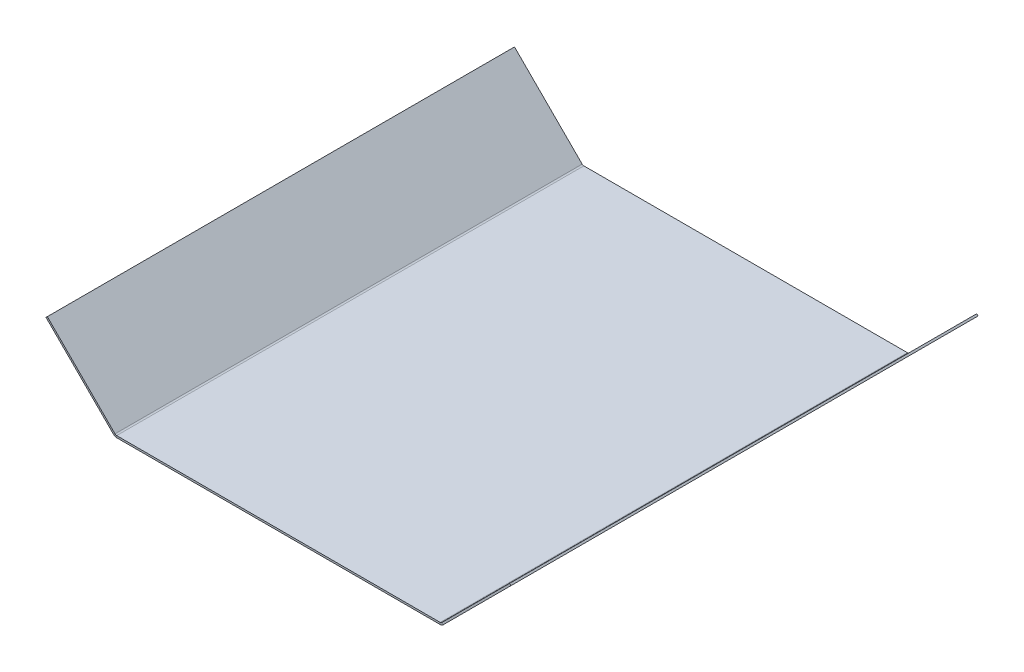
ISO-10303-21;
HEADER;
FILE_DESCRIPTION(('STEP AP214'),'2;1');
FILE_NAME('part.step','',(''),(''),'','','');
FILE_SCHEMA(('AUTOMOTIVE_DESIGN { 1 0 10303 214 1 1 1 1 }'));
ENDSEC;
DATA;
#1=APPLICATION_CONTEXT('core data for automotive mechanical design processes');
#2=APPLICATION_PROTOCOL_DEFINITION('international standard','automotive_design',2000,#1);
#3=PRODUCT_CONTEXT('',#1,'mechanical');
#4=PRODUCT('Part','Part','',(#3));
#5=PRODUCT_RELATED_PRODUCT_CATEGORY('part','',(#4));
#6=PRODUCT_DEFINITION_FORMATION('','',#4);
#7=PRODUCT_DEFINITION_CONTEXT('part definition',#1,'design');
#8=PRODUCT_DEFINITION('design','',#6,#7);
#9=PRODUCT_DEFINITION_SHAPE('','',#8);
#10=(LENGTH_UNIT() NAMED_UNIT(*) SI_UNIT(.MILLI.,.METRE.));
#11=(NAMED_UNIT(*) PLANE_ANGLE_UNIT() SI_UNIT($,.RADIAN.));
#12=(NAMED_UNIT(*) SI_UNIT($,.STERADIAN.) SOLID_ANGLE_UNIT());
#13=UNCERTAINTY_MEASURE_WITH_UNIT(LENGTH_MEASURE(1.E-05),#10,'distance_accuracy_value','');
#14=(GEOMETRIC_REPRESENTATION_CONTEXT(3) GLOBAL_UNCERTAINTY_ASSIGNED_CONTEXT((#13)) GLOBAL_UNIT_ASSIGNED_CONTEXT((#10,
#11,#12)) REPRESENTATION_CONTEXT('',''));
#15=CARTESIAN_POINT('',(0.,0.,0.));
#16=DIRECTION('',(0.,0.,1.));
#17=DIRECTION('',(1.,0.,0.));
#18=AXIS2_PLACEMENT_3D('',#15,#16,#17);
#19=CARTESIAN_POINT('',(69.2544155877285,0.,200.));
#20=DIRECTION('',(0.,0.,1.));
#21=DIRECTION('',(1.,0.,0.));
#22=AXIS2_PLACEMENT_3D('',#19,#20,#21);
#23=PLANE('',#22);
#24=DIRECTION('',(0.,1.,0.));
#25=VECTOR('',#24,1.);
#26=CARTESIAN_POINT('',(69.2544155877285,0.,200.));
#27=LINE('',#26,#25);
#28=CARTESIAN_POINT('',(69.2544155877285,0.,200.));
#29=VERTEX_POINT('',#28);
#30=CARTESIAN_POINT('',(69.2544155877285,0.8,200.));
#31=VERTEX_POINT('',#30);
#32=EDGE_CURVE('E11',#29,#31,#27,.T.);
#33=ORIENTED_EDGE('',*,*,#32,.F.);
#34=CARTESIAN_POINT('',(69.2544155877285,1.80000000000001,200.));
#35=DIRECTION('',(0.,0.,1.));
#36=DIRECTION('',(1.,0.,0.));
#37=AXIS2_PLACEMENT_3D('',#34,#35,#36);
#38=CIRCLE('',#37,1.8);
#39=CARTESIAN_POINT('',(70.5272077938642,0.527207793864231,200.));
#40=VERTEX_POINT('',#39);
#41=EDGE_CURVE('E247',#40,#29,#38,.F.);
#42=ORIENTED_EDGE('',*,*,#41,.F.);
#43=DIRECTION('',(0.707106781186547,-0.707106781186548,0.));
#44=VECTOR('',#43,1.);
#45=CARTESIAN_POINT('',(69.961522368915,1.09289321881346,200.));
#46=LINE('',#45,#44);
#47=CARTESIAN_POINT('',(69.961522368915,1.09289321881346,200.));
#48=VERTEX_POINT('',#47);
#49=EDGE_CURVE('E45',#48,#40,#46,.T.);
#50=ORIENTED_EDGE('',*,*,#49,.F.);
#51=CARTESIAN_POINT('',(69.2544155877285,1.80000000000001,200.));
#52=DIRECTION('',(0.,0.,1.));
#53=DIRECTION('',(1.,0.,0.));
#54=AXIS2_PLACEMENT_3D('',#51,#52,#53);
#55=CIRCLE('',#54,1.);
#56=EDGE_CURVE('E146',#48,#31,#55,.F.);
#57=ORIENTED_EDGE('',*,*,#56,.T.);
#58=EDGE_LOOP('',(#33,#42,#50,#57));
#59=FACE_BOUND('',#58,.T.);
#60=ADVANCED_FACE('F37',(#59),#23,.T.);
#61=CARTESIAN_POINT('',(69.961522368915,1.09289321881346,200.));
#62=DIRECTION('',(0.,0.,1.));
#63=DIRECTION('',(1.,0.,0.));
#64=AXIS2_PLACEMENT_3D('',#61,#62,#63);
#65=PLANE('',#64);
#66=DIRECTION('',(-1.,0.,0.));
#67=VECTOR('',#66,1.);
#68=CARTESIAN_POINT('',(-70.,0.,200.));
#69=LINE('',#68,#67);
#70=CARTESIAN_POINT('',(-69.2544155877284,0.,200.));
#71=VERTEX_POINT('',#70);
#72=EDGE_CURVE('E140',#29,#71,#69,.T.);
#73=ORIENTED_EDGE('',*,*,#72,.F.);
#74=ORIENTED_EDGE('',*,*,#32,.T.);
#75=DIRECTION('',(1.,0.,0.));
#76=VECTOR('',#75,1.);
#77=CARTESIAN_POINT('',(-70.,0.8,200.));
#78=LINE('',#77,#76);
#79=CARTESIAN_POINT('',(-69.2544155877284,0.8,200.));
#80=VERTEX_POINT('',#79);
#81=EDGE_CURVE('E137',#31,#80,#78,.F.);
#82=ORIENTED_EDGE('',*,*,#81,.T.);
#83=DIRECTION('',(0.,-1.,0.));
#84=VECTOR('',#83,1.);
#85=CARTESIAN_POINT('',(-69.2544155877284,0.8,200.));
#86=LINE('',#85,#84);
#87=EDGE_CURVE('E228',#80,#71,#86,.T.);
#88=ORIENTED_EDGE('',*,*,#87,.T.);
#89=EDGE_LOOP('',(#73,#74,#82,#88));
#90=FACE_BOUND('',#89,.T.);
#91=ADVANCED_FACE('F135',(#90),#65,.T.);
#92=CARTESIAN_POINT('',(70.5272077938642,0.527207793864231,0.));
#93=DIRECTION('',(0.,0.,-1.));
#94=DIRECTION('',(-1.,0.,0.));
#95=AXIS2_PLACEMENT_3D('',#92,#93,#94);
#96=PLANE('',#95);
#97=DIRECTION('',(-0.707106781186547,0.707106781186548,0.));
#98=VECTOR('',#97,1.);
#99=CARTESIAN_POINT('',(70.5272077938642,0.527207793864231,0.));
#100=LINE('',#99,#98);
#101=CARTESIAN_POINT('',(70.5272077938642,0.527207793864231,0.));
#102=VERTEX_POINT('',#101);
#103=CARTESIAN_POINT('',(69.961522368915,1.09289321881346,0.));
#104=VERTEX_POINT('',#103);
#105=EDGE_CURVE('E233',#102,#104,#100,.T.);
#106=ORIENTED_EDGE('',*,*,#105,.F.);
#107=CARTESIAN_POINT('',(69.2544155877285,1.80000000000001,0.));
#108=DIRECTION('',(0.,0.,1.));
#109=DIRECTION('',(1.,0.,0.));
#110=AXIS2_PLACEMENT_3D('',#107,#108,#109);
#111=CIRCLE('',#110,1.8);
#112=CARTESIAN_POINT('',(69.2544155877285,0.,0.));
#113=VERTEX_POINT('',#112);
#114=EDGE_CURVE('E185',#102,#113,#111,.F.);
#115=ORIENTED_EDGE('',*,*,#114,.T.);
#116=DIRECTION('',(0.,-1.,0.));
#117=VECTOR('',#116,1.);
#118=CARTESIAN_POINT('',(69.2544155877285,0.8,0.));
#119=LINE('',#118,#117);
#120=CARTESIAN_POINT('',(69.2544155877285,0.8,0.));
#121=VERTEX_POINT('',#120);
#122=EDGE_CURVE('E231',#121,#113,#119,.T.);
#123=ORIENTED_EDGE('',*,*,#122,.F.);
#124=CARTESIAN_POINT('',(69.2544155877285,1.80000000000001,0.));
#125=DIRECTION('',(0.,0.,1.));
#126=DIRECTION('',(1.,0.,0.));
#127=AXIS2_PLACEMENT_3D('',#124,#125,#126);
#128=CIRCLE('',#127,1.);
#129=EDGE_CURVE('E158',#104,#121,#128,.F.);
#130=ORIENTED_EDGE('',*,*,#129,.F.);
#131=EDGE_LOOP('',(#106,#115,#123,#130));
#132=FACE_BOUND('',#131,.T.);
#133=ADVANCED_FACE('F285',(#132),#96,.T.);
#134=CARTESIAN_POINT('',(69.2544155877285,0.8,0.));
#135=DIRECTION('',(0.,0.,-1.));
#136=DIRECTION('',(-1.,0.,0.));
#137=AXIS2_PLACEMENT_3D('',#134,#135,#136);
#138=PLANE('',#137);
#139=DIRECTION('',(-0.707106781186546,-0.707106781186549,0.));
#140=VECTOR('',#139,1.);
#141=CARTESIAN_POINT('',(70.,0.,0.));
#142=LINE('',#141,#140);
#143=CARTESIAN_POINT('',(99.4999999999999,29.5,0.));
#144=VERTEX_POINT('',#143);
#145=EDGE_CURVE('E188',#144,#102,#142,.T.);
#146=ORIENTED_EDGE('',*,*,#145,.T.);
#147=ORIENTED_EDGE('',*,*,#105,.T.);
#148=DIRECTION('',(-0.707106781186546,-0.707106781186549,0.));
#149=VECTOR('',#148,1.);
#150=CARTESIAN_POINT('',(69.4343145750508,0.565685424949237,0.));
#151=LINE('',#150,#149);
#152=CARTESIAN_POINT('',(98.9343145750506,30.0656854249492,0.));
#153=VERTEX_POINT('',#152);
#154=EDGE_CURVE('E194',#153,#104,#151,.T.);
#155=ORIENTED_EDGE('',*,*,#154,.F.);
#156=DIRECTION('',(0.707106781186548,-0.707106781186548,0.));
#157=VECTOR('',#156,1.);
#158=CARTESIAN_POINT('',(98.9343145750506,30.0656854249492,0.));
#159=LINE('',#158,#157);
#160=EDGE_CURVE('E191',#153,#144,#159,.T.);
#161=ORIENTED_EDGE('',*,*,#160,.T.);
#162=EDGE_LOOP('',(#146,#147,#155,#161));
#163=FACE_BOUND('',#162,.T.);
#164=ADVANCED_FACE('F288',(#163),#138,.T.);
#165=CARTESIAN_POINT('',(-70.5272077938642,0.527207793864216,200.));
#166=DIRECTION('',(0.,0.,1.));
#167=DIRECTION('',(1.,0.,0.));
#168=AXIS2_PLACEMENT_3D('',#165,#166,#167);
#169=PLANE('',#168);
#170=DIRECTION('',(0.707106781186549,0.707106781186546,0.));
#171=VECTOR('',#170,1.);
#172=CARTESIAN_POINT('',(-70.5272077938642,0.527207793864216,200.));
#173=LINE('',#172,#171);
#174=CARTESIAN_POINT('',(-70.5272077938642,0.527207793864216,200.));
#175=VERTEX_POINT('',#174);
#176=CARTESIAN_POINT('',(-69.961522368915,1.09289321881345,200.));
#177=VERTEX_POINT('',#176);
#178=EDGE_CURVE('E53',#175,#177,#173,.T.);
#179=ORIENTED_EDGE('',*,*,#178,.F.);
#180=CARTESIAN_POINT('',(-69.2544155877284,1.8,200.));
#181=DIRECTION('',(0.,0.,1.));
#182=DIRECTION('',(1.,0.,0.));
#183=AXIS2_PLACEMENT_3D('',#180,#181,#182);
#184=CIRCLE('',#183,1.8);
#185=EDGE_CURVE('E257',#71,#175,#184,.F.);
#186=ORIENTED_EDGE('',*,*,#185,.F.);
#187=ORIENTED_EDGE('',*,*,#87,.F.);
#188=CARTESIAN_POINT('',(-69.2544155877284,1.8,200.));
#189=DIRECTION('',(0.,0.,1.));
#190=DIRECTION('',(1.,0.,0.));
#191=AXIS2_PLACEMENT_3D('',#188,#189,#190);
#192=CIRCLE('',#191,1.);
#193=EDGE_CURVE('E166',#80,#177,#192,.F.);
#194=ORIENTED_EDGE('',*,*,#193,.T.);
#195=EDGE_LOOP('',(#179,#186,#187,#194));
#196=FACE_BOUND('',#195,.T.);
#197=ADVANCED_FACE('F280',(#196),#169,.T.);
#198=CARTESIAN_POINT('',(-69.2544155877284,0.8,200.));
#199=DIRECTION('',(0.,0.,1.));
#200=DIRECTION('',(1.,0.,0.));
#201=AXIS2_PLACEMENT_3D('',#198,#199,#200);
#202=PLANE('',#201);
#203=DIRECTION('',(-0.707106781186546,0.707106781186549,0.));
#204=VECTOR('',#203,1.);
#205=CARTESIAN_POINT('',(-70.,0.,200.));
#206=LINE('',#205,#204);
#207=CARTESIAN_POINT('',(-99.4999999999999,29.5,200.));
#208=VERTEX_POINT('',#207);
#209=EDGE_CURVE('E260',#175,#208,#206,.T.);
#210=ORIENTED_EDGE('',*,*,#209,.F.);
#211=ORIENTED_EDGE('',*,*,#178,.T.);
#212=DIRECTION('',(-0.707106781186546,0.707106781186549,0.));
#213=VECTOR('',#212,1.);
#214=CARTESIAN_POINT('',(-69.4343145750508,0.565685424949237,200.));
#215=LINE('',#214,#213);
#216=CARTESIAN_POINT('',(-98.9343145750506,30.0656854249492,200.));
#217=VERTEX_POINT('',#216);
#218=EDGE_CURVE('E107',#177,#217,#215,.T.);
#219=ORIENTED_EDGE('',*,*,#218,.T.);
#220=DIRECTION('',(0.707106781186548,0.707106781186548,0.));
#221=VECTOR('',#220,1.);
#222=CARTESIAN_POINT('',(-99.4999999999999,29.5,200.));
#223=LINE('',#222,#221);
#224=EDGE_CURVE('E263',#208,#217,#223,.T.);
#225=ORIENTED_EDGE('',*,*,#224,.F.);
#226=EDGE_LOOP('',(#210,#211,#219,#225));
#227=FACE_BOUND('',#226,.T.);
#228=ADVANCED_FACE('F269',(#227),#202,.T.);
#229=CARTESIAN_POINT('',(-69.2544155877284,0.,0.));
#230=DIRECTION('',(0.,0.,-1.));
#231=DIRECTION('',(-1.,0.,0.));
#232=AXIS2_PLACEMENT_3D('',#229,#230,#231);
#233=PLANE('',#232);
#234=DIRECTION('',(0.,1.,0.));
#235=VECTOR('',#234,1.);
#236=CARTESIAN_POINT('',(-69.2544155877284,0.,0.));
#237=LINE('',#236,#235);
#238=CARTESIAN_POINT('',(-69.2544155877284,0.,0.));
#239=VERTEX_POINT('',#238);
#240=CARTESIAN_POINT('',(-69.2544155877284,0.8,0.));
#241=VERTEX_POINT('',#240);
#242=EDGE_CURVE('E94',#239,#241,#237,.T.);
#243=ORIENTED_EDGE('',*,*,#242,.F.);
#244=CARTESIAN_POINT('',(-69.2544155877284,1.8,0.));
#245=DIRECTION('',(0.,0.,1.));
#246=DIRECTION('',(1.,0.,0.));
#247=AXIS2_PLACEMENT_3D('',#244,#245,#246);
#248=CIRCLE('',#247,1.8);
#249=CARTESIAN_POINT('',(-70.5272077938642,0.527207793864216,0.));
#250=VERTEX_POINT('',#249);
#251=EDGE_CURVE('E181',#239,#250,#248,.F.);
#252=ORIENTED_EDGE('',*,*,#251,.T.);
#253=DIRECTION('',(-0.707106781186549,-0.707106781186546,0.));
#254=VECTOR('',#253,1.);
#255=CARTESIAN_POINT('',(-69.961522368915,1.09289321881345,0.));
#256=LINE('',#255,#254);
#257=CARTESIAN_POINT('',(-69.961522368915,1.09289321881345,0.));
#258=VERTEX_POINT('',#257);
#259=EDGE_CURVE('E101',#258,#250,#256,.T.);
#260=ORIENTED_EDGE('',*,*,#259,.F.);
#261=CARTESIAN_POINT('',(-69.2544155877284,1.8,0.));
#262=DIRECTION('',(0.,0.,1.));
#263=DIRECTION('',(1.,0.,0.));
#264=AXIS2_PLACEMENT_3D('',#261,#262,#263);
#265=CIRCLE('',#264,1.);
#266=EDGE_CURVE('E200',#241,#258,#265,.F.);
#267=ORIENTED_EDGE('',*,*,#266,.F.);
#268=EDGE_LOOP('',(#243,#252,#260,#267));
#269=FACE_BOUND('',#268,.T.);
#270=ADVANCED_FACE('F317',(#269),#233,.T.);
#271=CARTESIAN_POINT('',(-69.961522368915,1.09289321881345,0.));
#272=DIRECTION('',(0.,0.,-1.));
#273=DIRECTION('',(-1.,0.,0.));
#274=AXIS2_PLACEMENT_3D('',#271,#272,#273);
#275=PLANE('',#274);
#276=DIRECTION('',(-1.,0.,0.));
#277=VECTOR('',#276,1.);
#278=CARTESIAN_POINT('',(-70.,0.,0.));
#279=LINE('',#278,#277);
#280=EDGE_CURVE('E183',#113,#239,#279,.T.);
#281=ORIENTED_EDGE('',*,*,#280,.T.);
#282=ORIENTED_EDGE('',*,*,#242,.T.);
#283=DIRECTION('',(1.,0.,0.));
#284=VECTOR('',#283,1.);
#285=CARTESIAN_POINT('',(-70.,0.8,0.));
#286=LINE('',#285,#284);
#287=EDGE_CURVE('E198',#121,#241,#286,.F.);
#288=ORIENTED_EDGE('',*,*,#287,.F.);
#289=ORIENTED_EDGE('',*,*,#122,.T.);
#290=EDGE_LOOP('',(#281,#282,#288,#289));
#291=FACE_BOUND('',#290,.T.);
#292=ADVANCED_FACE('F320',(#291),#275,.T.);
#293=CARTESIAN_POINT('',(-69.4343145750508,0.565685424949237,200.));
#294=DIRECTION('',(-0.707106781186549,-0.707106781186546,0.));
#295=DIRECTION('',(0.707106781186546,-0.707106781186549,0.));
#296=AXIS2_PLACEMENT_3D('',#293,#294,#295);
#297=PLANE('',#296);
#298=DIRECTION('',(-0.707106781186546,0.707106781186549,0.));
#299=VECTOR('',#298,1.);
#300=CARTESIAN_POINT('',(-69.4343145750508,0.565685424949237,0.));
#301=LINE('',#300,#299);
#302=CARTESIAN_POINT('',(-98.9343145750506,30.0656854249492,0.));
#303=VERTEX_POINT('',#302);
#304=EDGE_CURVE('E172',#258,#303,#301,.T.);
#305=ORIENTED_EDGE('',*,*,#304,.T.);
#306=DIRECTION('',(0.,0.,-1.));
#307=VECTOR('',#306,1.);
#308=CARTESIAN_POINT('',(-98.9343145750506,30.0656854249492,200.));
#309=LINE('',#308,#307);
#310=EDGE_CURVE('E224',#217,#303,#309,.T.);
#311=ORIENTED_EDGE('',*,*,#310,.F.);
#312=ORIENTED_EDGE('',*,*,#218,.F.);
#313=DIRECTION('',(0.,0.,-1.));
#314=VECTOR('',#313,1.);
#315=CARTESIAN_POINT('',(-69.961522368915,1.09289321881345,200.));
#316=LINE('',#315,#314);
#317=EDGE_CURVE('E168',#177,#258,#316,.T.);
#318=ORIENTED_EDGE('',*,*,#317,.T.);
#319=EDGE_LOOP('',(#305,#311,#312,#318));
#320=FACE_BOUND('',#319,.T.);
#321=ADVANCED_FACE('F323',(#320),#297,.F.);
#322=CARTESIAN_POINT('',(-99.4999999999999,29.5,200.));
#323=DIRECTION('',(-0.707106781186548,0.707106781186548,0.));
#324=DIRECTION('',(-0.707106781186548,-0.707106781186548,0.));
#325=AXIS2_PLACEMENT_3D('',#322,#323,#324);
#326=PLANE('',#325);
#327=DIRECTION('',(0.707106781186548,0.707106781186548,0.));
#328=VECTOR('',#327,1.);
#329=CARTESIAN_POINT('',(-99.4999999999999,29.5,0.));
#330=LINE('',#329,#328);
#331=CARTESIAN_POINT('',(-99.4999999999999,29.5,0.));
#332=VERTEX_POINT('',#331);
#333=EDGE_CURVE('E175',#332,#303,#330,.T.);
#334=ORIENTED_EDGE('',*,*,#333,.F.);
#335=DIRECTION('',(0.,0.,-1.));
#336=VECTOR('',#335,1.);
#337=CARTESIAN_POINT('',(-99.4999999999999,29.5,200.));
#338=LINE('',#337,#336);
#339=EDGE_CURVE('E222',#208,#332,#338,.T.);
#340=ORIENTED_EDGE('',*,*,#339,.F.);
#341=ORIENTED_EDGE('',*,*,#224,.T.);
#342=ORIENTED_EDGE('',*,*,#310,.T.);
#343=EDGE_LOOP('',(#334,#340,#341,#342));
#344=FACE_BOUND('',#343,.T.);
#345=ADVANCED_FACE('F268',(#344),#326,.T.);
#346=CARTESIAN_POINT('',(-70.,0.,200.));
#347=DIRECTION('',(-0.707106781186549,-0.707106781186546,0.));
#348=DIRECTION('',(0.707106781186546,-0.707106781186549,0.));
#349=AXIS2_PLACEMENT_3D('',#346,#347,#348);
#350=PLANE('',#349);
#351=DIRECTION('',(-0.707106781186546,0.707106781186549,0.));
#352=VECTOR('',#351,1.);
#353=CARTESIAN_POINT('',(-70.,0.,0.));
#354=LINE('',#353,#352);
#355=EDGE_CURVE('E178',#250,#332,#354,.T.);
#356=ORIENTED_EDGE('',*,*,#355,.F.);
#357=DIRECTION('',(0.,0.,-1.));
#358=VECTOR('',#357,1.);
#359=CARTESIAN_POINT('',(-70.5272077938642,0.527207793864216,200.));
#360=LINE('',#359,#358);
#361=EDGE_CURVE('E219',#175,#250,#360,.T.);
#362=ORIENTED_EDGE('',*,*,#361,.F.);
#363=ORIENTED_EDGE('',*,*,#209,.T.);
#364=ORIENTED_EDGE('',*,*,#339,.T.);
#365=EDGE_LOOP('',(#356,#362,#363,#364));
#366=FACE_BOUND('',#365,.T.);
#367=ADVANCED_FACE('F273',(#366),#350,.T.);
#368=CARTESIAN_POINT('',(-69.2544155877284,1.8,200.));
#369=DIRECTION('',(0.,0.,-1.));
#370=DIRECTION('',(-1.,0.,0.));
#371=AXIS2_PLACEMENT_3D('',#368,#369,#370);
#372=CYLINDRICAL_SURFACE('',#371,1.8);
#373=ORIENTED_EDGE('',*,*,#251,.F.);
#374=DIRECTION('',(0.,0.,-1.));
#375=VECTOR('',#374,1.);
#376=CARTESIAN_POINT('',(-69.2544155877284,0.,200.));
#377=LINE('',#376,#375);
#378=EDGE_CURVE('E216',#71,#239,#377,.T.);
#379=ORIENTED_EDGE('',*,*,#378,.F.);
#380=ORIENTED_EDGE('',*,*,#185,.T.);
#381=ORIENTED_EDGE('',*,*,#361,.T.);
#382=EDGE_LOOP('',(#373,#379,#380,#381));
#383=FACE_BOUND('',#382,.T.);
#384=ADVANCED_FACE('F276',(#383),#372,.T.);
#385=CARTESIAN_POINT('',(-70.,0.,200.));
#386=DIRECTION('',(0.,-1.,0.));
#387=DIRECTION('',(0.,0.,-1.));
#388=AXIS2_PLACEMENT_3D('',#385,#386,#387);
#389=PLANE('',#388);
#390=ORIENTED_EDGE('',*,*,#280,.F.);
#391=DIRECTION('',(0.,0.,-1.));
#392=VECTOR('',#391,1.);
#393=CARTESIAN_POINT('',(69.2544155877285,0.,200.));
#394=LINE('',#393,#392);
#395=EDGE_CURVE('E213',#29,#113,#394,.T.);
#396=ORIENTED_EDGE('',*,*,#395,.F.);
#397=ORIENTED_EDGE('',*,*,#72,.T.);
#398=ORIENTED_EDGE('',*,*,#378,.T.);
#399=EDGE_LOOP('',(#390,#396,#397,#398));
#400=FACE_BOUND('',#399,.T.);
#401=ADVANCED_FACE('F283',(#400),#389,.T.);
#402=CARTESIAN_POINT('',(69.2544155877285,1.80000000000001,200.));
#403=DIRECTION('',(0.,0.,-1.));
#404=DIRECTION('',(-1.,0.,0.));
#405=AXIS2_PLACEMENT_3D('',#402,#403,#404);
#406=CYLINDRICAL_SURFACE('',#405,1.8);
#407=ORIENTED_EDGE('',*,*,#114,.F.);
#408=DIRECTION('',(0.,0.,-1.));
#409=VECTOR('',#408,1.);
#410=CARTESIAN_POINT('',(70.5272077938642,0.527207793864231,200.));
#411=LINE('',#410,#409);
#412=EDGE_CURVE('E210',#40,#102,#411,.T.);
#413=ORIENTED_EDGE('',*,*,#412,.F.);
#414=ORIENTED_EDGE('',*,*,#41,.T.);
#415=ORIENTED_EDGE('',*,*,#395,.T.);
#416=EDGE_LOOP('',(#407,#413,#414,#415));
#417=FACE_BOUND('',#416,.T.);
#418=ADVANCED_FACE('F246',(#417),#406,.T.);
#419=CARTESIAN_POINT('',(70.,0.,200.));
#420=DIRECTION('',(0.707106781186549,-0.707106781186546,0.));
#421=DIRECTION('',(0.707106781186546,0.707106781186549,0.));
#422=AXIS2_PLACEMENT_3D('',#419,#420,#421);
#423=PLANE('',#422);
#424=ORIENTED_EDGE('',*,*,#145,.F.);
#425=DIRECTION('',(0.,0.,-1.));
#426=VECTOR('',#425,1.);
#427=CARTESIAN_POINT('',(99.4999999999999,29.5,200.));
#428=LINE('',#427,#426);
#429=CARTESIAN_POINT('',(99.4999999999999,29.5,200.));
#430=VERTEX_POINT('',#429);
#431=EDGE_CURVE('E208',#430,#144,#428,.T.);
#432=ORIENTED_EDGE('',*,*,#431,.F.);
#433=DIRECTION('',(-0.707106781186546,-0.707106781186549,0.));
#434=VECTOR('',#433,1.);
#435=CARTESIAN_POINT('',(70.,0.,200.));
#436=LINE('',#435,#434);
#437=EDGE_CURVE('E240',#430,#40,#436,.T.);
#438=ORIENTED_EDGE('',*,*,#437,.T.);
#439=ORIENTED_EDGE('',*,*,#412,.T.);
#440=EDGE_LOOP('',(#424,#432,#438,#439));
#441=FACE_BOUND('',#440,.T.);
#442=ADVANCED_FACE('F251',(#441),#423,.T.);
#443=CARTESIAN_POINT('',(98.9343145750506,30.0656854249492,200.));
#444=DIRECTION('',(0.707106781186548,0.707106781186548,0.));
#445=DIRECTION('',(-0.707106781186548,0.707106781186548,0.));
#446=AXIS2_PLACEMENT_3D('',#443,#444,#445);
#447=PLANE('',#446);
#448=ORIENTED_EDGE('',*,*,#160,.F.);
#449=DIRECTION('',(0.,0.,-1.));
#450=VECTOR('',#449,1.);
#451=CARTESIAN_POINT('',(98.9343145750506,30.0656854249492,200.));
#452=LINE('',#451,#450);
#453=CARTESIAN_POINT('',(98.9343145750506,30.0656854249492,200.));
#454=VERTEX_POINT('',#453);
#455=EDGE_CURVE('E206',#454,#153,#452,.T.);
#456=ORIENTED_EDGE('',*,*,#455,.F.);
#457=DIRECTION('',(0.707106781186548,-0.707106781186548,0.));
#458=VECTOR('',#457,1.);
#459=CARTESIAN_POINT('',(98.9343145750506,30.0656854249492,200.));
#460=LINE('',#459,#458);
#461=EDGE_CURVE('E252',#454,#430,#460,.T.);
#462=ORIENTED_EDGE('',*,*,#461,.T.);
#463=ORIENTED_EDGE('',*,*,#431,.T.);
#464=EDGE_LOOP('',(#448,#456,#462,#463));
#465=FACE_BOUND('',#464,.T.);
#466=ADVANCED_FACE('F293',(#465),#447,.T.);
#467=CARTESIAN_POINT('',(69.4343145750508,0.565685424949237,200.));
#468=DIRECTION('',(0.707106781186549,-0.707106781186546,0.));
#469=DIRECTION('',(0.707106781186546,0.707106781186549,0.));
#470=AXIS2_PLACEMENT_3D('',#467,#468,#469);
#471=PLANE('',#470);
#472=ORIENTED_EDGE('',*,*,#154,.T.);
#473=DIRECTION('',(0.,0.,-1.));
#474=VECTOR('',#473,1.);
#475=CARTESIAN_POINT('',(69.961522368915,1.09289321881346,200.));
#476=LINE('',#475,#474);
#477=EDGE_CURVE('E160',#48,#104,#476,.T.);
#478=ORIENTED_EDGE('',*,*,#477,.F.);
#479=DIRECTION('',(-0.707106781186546,-0.707106781186549,0.));
#480=VECTOR('',#479,1.);
#481=CARTESIAN_POINT('',(69.4343145750508,0.565685424949237,200.));
#482=LINE('',#481,#480);
#483=EDGE_CURVE('E151',#454,#48,#482,.T.);
#484=ORIENTED_EDGE('',*,*,#483,.F.);
#485=ORIENTED_EDGE('',*,*,#455,.T.);
#486=EDGE_LOOP('',(#472,#478,#484,#485));
#487=FACE_BOUND('',#486,.T.);
#488=ADVANCED_FACE('F291',(#487),#471,.F.);
#489=CARTESIAN_POINT('',(69.2544155877285,1.80000000000001,200.));
#490=DIRECTION('',(0.,0.,-1.));
#491=DIRECTION('',(-1.,0.,0.));
#492=AXIS2_PLACEMENT_3D('',#489,#490,#491);
#493=CYLINDRICAL_SURFACE('',#492,1.);
#494=ORIENTED_EDGE('',*,*,#129,.T.);
#495=DIRECTION('',(0.,0.,-1.));
#496=VECTOR('',#495,1.);
#497=CARTESIAN_POINT('',(69.2544155877285,0.8,200.));
#498=LINE('',#497,#496);
#499=EDGE_CURVE('E155',#31,#121,#498,.T.);
#500=ORIENTED_EDGE('',*,*,#499,.F.);
#501=ORIENTED_EDGE('',*,*,#56,.F.);
#502=ORIENTED_EDGE('',*,*,#477,.T.);
#503=EDGE_LOOP('',(#494,#500,#501,#502));
#504=FACE_BOUND('',#503,.T.);
#505=ADVANCED_FACE('F156',(#504),#493,.F.);
#506=CARTESIAN_POINT('',(-70.,0.8,200.));
#507=DIRECTION('',(0.,-1.,0.));
#508=DIRECTION('',(0.,0.,-1.));
#509=AXIS2_PLACEMENT_3D('',#506,#507,#508);
#510=PLANE('',#509);
#511=ORIENTED_EDGE('',*,*,#287,.T.);
#512=DIRECTION('',(0.,0.,-1.));
#513=VECTOR('',#512,1.);
#514=CARTESIAN_POINT('',(-69.2544155877284,0.8,200.));
#515=LINE('',#514,#513);
#516=EDGE_CURVE('E161',#80,#241,#515,.T.);
#517=ORIENTED_EDGE('',*,*,#516,.F.);
#518=ORIENTED_EDGE('',*,*,#81,.F.);
#519=ORIENTED_EDGE('',*,*,#499,.T.);
#520=EDGE_LOOP('',(#511,#517,#518,#519));
#521=FACE_BOUND('',#520,.T.);
#522=ADVANCED_FACE('F163',(#521),#510,.F.);
#523=CARTESIAN_POINT('',(-69.2544155877284,1.8,200.));
#524=DIRECTION('',(0.,0.,-1.));
#525=DIRECTION('',(-1.,0.,0.));
#526=AXIS2_PLACEMENT_3D('',#523,#524,#525);
#527=CYLINDRICAL_SURFACE('',#526,1.);
#528=ORIENTED_EDGE('',*,*,#266,.T.);
#529=ORIENTED_EDGE('',*,*,#317,.F.);
#530=ORIENTED_EDGE('',*,*,#193,.F.);
#531=ORIENTED_EDGE('',*,*,#516,.T.);
#532=EDGE_LOOP('',(#528,#529,#530,#531));
#533=FACE_BOUND('',#532,.T.);
#534=ADVANCED_FACE('F375',(#533),#527,.F.);
#535=CARTESIAN_POINT('',(-69.2544155877284,1.8,200.));
#536=DIRECTION('',(0.,0.,1.));
#537=DIRECTION('',(1.,0.,0.));
#538=AXIS2_PLACEMENT_3D('',#535,#536,#537);
#539=PLANE('',#538);
#540=ORIENTED_EDGE('',*,*,#483,.T.);
#541=ORIENTED_EDGE('',*,*,#49,.T.);
#542=ORIENTED_EDGE('',*,*,#437,.F.);
#543=ORIENTED_EDGE('',*,*,#461,.F.);
#544=EDGE_LOOP('',(#540,#541,#542,#543));
#545=FACE_BOUND('',#544,.T.);
#546=ADVANCED_FACE('F237',(#545),#539,.T.);
#547=CARTESIAN_POINT('',(-69.2544155877284,1.8,0.));
#548=DIRECTION('',(0.,0.,1.));
#549=DIRECTION('',(1.,0.,0.));
#550=AXIS2_PLACEMENT_3D('',#547,#548,#549);
#551=PLANE('',#550);
#552=ORIENTED_EDGE('',*,*,#304,.F.);
#553=ORIENTED_EDGE('',*,*,#259,.T.);
#554=ORIENTED_EDGE('',*,*,#355,.T.);
#555=ORIENTED_EDGE('',*,*,#333,.T.);
#556=EDGE_LOOP('',(#552,#553,#554,#555));
#557=FACE_BOUND('',#556,.T.);
#558=ADVANCED_FACE('F395',(#557),#551,.F.);
#559=CLOSED_SHELL('',(#60,#91,#133,#164,#197,#228,#270,#292,#321,#345,#367,#384,#401,#418,#442,
#466,#488,#505,#522,#534,#546,#558));
#560=MANIFOLD_SOLID_BREP('B2',#559);
#561=ADVANCED_BREP_SHAPE_REPRESENTATION('',(#18,#560),#14);
#562=SHAPE_DEFINITION_REPRESENTATION(#9,#561);
ENDSEC;
END-ISO-10303-21;
